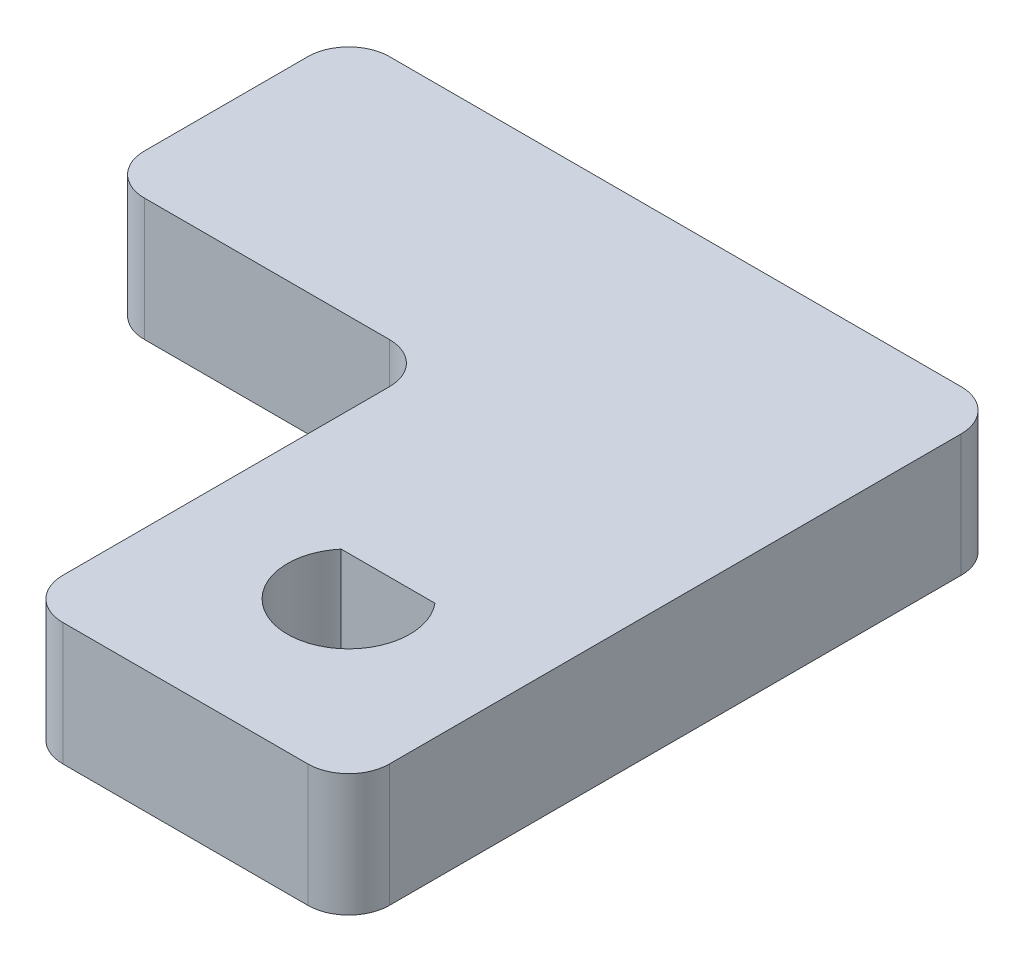
ISO-10303-21;
HEADER;
FILE_DESCRIPTION(('STEP AP214'),'2;1');
FILE_NAME('part.step','',(''),(''),'','','');
FILE_SCHEMA(('AUTOMOTIVE_DESIGN { 1 0 10303 214 1 1 1 1 }'));
ENDSEC;
DATA;
#1=APPLICATION_CONTEXT('core data for automotive mechanical design processes');
#2=APPLICATION_PROTOCOL_DEFINITION('international standard','automotive_design',2000,#1);
#3=PRODUCT_CONTEXT('',#1,'mechanical');
#4=PRODUCT('Part','Part','',(#3));
#5=PRODUCT_RELATED_PRODUCT_CATEGORY('part','',(#4));
#6=PRODUCT_DEFINITION_FORMATION('','',#4);
#7=PRODUCT_DEFINITION_CONTEXT('part definition',#1,'design');
#8=PRODUCT_DEFINITION('design','',#6,#7);
#9=PRODUCT_DEFINITION_SHAPE('','',#8);
#10=(LENGTH_UNIT() NAMED_UNIT(*) SI_UNIT(.MILLI.,.METRE.));
#11=(NAMED_UNIT(*) PLANE_ANGLE_UNIT() SI_UNIT($,.RADIAN.));
#12=(NAMED_UNIT(*) SI_UNIT($,.STERADIAN.) SOLID_ANGLE_UNIT());
#13=UNCERTAINTY_MEASURE_WITH_UNIT(LENGTH_MEASURE(1.E-05),#10,'distance_accuracy_value','');
#14=(GEOMETRIC_REPRESENTATION_CONTEXT(3) GLOBAL_UNCERTAINTY_ASSIGNED_CONTEXT((#13)) GLOBAL_UNIT_ASSIGNED_CONTEXT((#10,
#11,#12)) REPRESENTATION_CONTEXT('',''));
#15=CARTESIAN_POINT('',(0.,0.,0.));
#16=DIRECTION('',(0.,0.,1.));
#17=DIRECTION('',(1.,0.,0.));
#18=AXIS2_PLACEMENT_3D('',#15,#16,#17);
#19=CARTESIAN_POINT('',(-14.2346933710064,3.,-8.));
#20=DIRECTION('',(0.,0.,-1.));
#21=DIRECTION('',(-1.,0.,0.));
#22=AXIS2_PLACEMENT_3D('',#19,#20,#21);
#23=PLANE('',#22);
#24=DIRECTION('',(1.,0.,0.));
#25=VECTOR('',#24,1.);
#26=CARTESIAN_POINT('',(-14.2346933710064,0.,-8.));
#27=LINE('',#26,#25);
#28=CARTESIAN_POINT('',(-21.2346933710064,0.,-8.));
#29=VERTEX_POINT('',#28);
#30=CARTESIAN_POINT('',(-15.2346933710064,0.,-8.));
#31=VERTEX_POINT('',#30);
#32=EDGE_CURVE('E149',#29,#31,#27,.T.);
#33=ORIENTED_EDGE('',*,*,#32,.T.);
#34=DIRECTION('',(0.,-1.,0.));
#35=VECTOR('',#34,1.);
#36=CARTESIAN_POINT('',(-15.2346933710064,3.,-8.));
#37=LINE('',#36,#35);
#38=CARTESIAN_POINT('',(-15.2346933710064,3.,-8.));
#39=VERTEX_POINT('',#38);
#40=EDGE_CURVE('E234',#31,#39,#37,.F.);
#41=ORIENTED_EDGE('',*,*,#40,.T.);
#42=DIRECTION('',(1.,0.,0.));
#43=VECTOR('',#42,1.);
#44=CARTESIAN_POINT('',(-14.2346933710064,3.,-8.));
#45=LINE('',#44,#43);
#46=CARTESIAN_POINT('',(-21.2346933710064,3.,-8.));
#47=VERTEX_POINT('',#46);
#48=EDGE_CURVE('E151',#47,#39,#45,.T.);
#49=ORIENTED_EDGE('',*,*,#48,.F.);
#50=DIRECTION('',(0.,-1.,0.));
#51=VECTOR('',#50,1.);
#52=CARTESIAN_POINT('',(-21.2346933710064,3.,-8.));
#53=LINE('',#52,#51);
#54=EDGE_CURVE('E191',#47,#29,#53,.T.);
#55=ORIENTED_EDGE('',*,*,#54,.T.);
#56=EDGE_LOOP('',(#33,#41,#49,#55));
#57=FACE_BOUND('',#56,.T.);
#58=ADVANCED_FACE('F33',(#57),#23,.F.);
#59=CARTESIAN_POINT('',(-14.2346933710064,3.,2.));
#60=DIRECTION('',(1.,0.,0.));
#61=DIRECTION('',(0.,0.,-1.));
#62=AXIS2_PLACEMENT_3D('',#59,#60,#61);
#63=PLANE('',#62);
#64=DIRECTION('',(0.,0.,1.));
#65=VECTOR('',#64,1.);
#66=CARTESIAN_POINT('',(-14.2346933710064,3.,2.));
#67=LINE('',#66,#65);
#68=CARTESIAN_POINT('',(-14.2346933710064,3.,-7.));
#69=VERTEX_POINT('',#68);
#70=CARTESIAN_POINT('',(-14.2346933710064,3.,0.999999999999998));
#71=VERTEX_POINT('',#70);
#72=EDGE_CURVE('E154',#69,#71,#67,.T.);
#73=ORIENTED_EDGE('',*,*,#72,.F.);
#74=DIRECTION('',(0.,-1.,0.));
#75=VECTOR('',#74,1.);
#76=CARTESIAN_POINT('',(-14.2346933710064,0.,-7.));
#77=LINE('',#76,#75);
#78=CARTESIAN_POINT('',(-14.2346933710064,0.,-7.));
#79=VERTEX_POINT('',#78);
#80=EDGE_CURVE('E231',#69,#79,#77,.T.);
#81=ORIENTED_EDGE('',*,*,#80,.T.);
#82=DIRECTION('',(0.,0.,1.));
#83=VECTOR('',#82,1.);
#84=CARTESIAN_POINT('',(-14.2346933710064,0.,2.));
#85=LINE('',#84,#83);
#86=CARTESIAN_POINT('',(-14.2346933710064,0.,0.999999999999998));
#87=VERTEX_POINT('',#86);
#88=EDGE_CURVE('E170',#79,#87,#85,.T.);
#89=ORIENTED_EDGE('',*,*,#88,.T.);
#90=DIRECTION('',(0.,-1.,0.));
#91=VECTOR('',#90,1.);
#92=CARTESIAN_POINT('',(-14.2346933710064,3.,0.999999999999998));
#93=LINE('',#92,#91);
#94=EDGE_CURVE('E217',#87,#71,#93,.F.);
#95=ORIENTED_EDGE('',*,*,#94,.T.);
#96=EDGE_LOOP('',(#73,#81,#89,#95));
#97=FACE_BOUND('',#96,.T.);
#98=ADVANCED_FACE('F249',(#97),#63,.F.);
#99=CARTESIAN_POINT('',(-6.23469337100641,3.,2.));
#100=DIRECTION('',(0.,0.,-1.));
#101=DIRECTION('',(-1.,0.,0.));
#102=AXIS2_PLACEMENT_3D('',#99,#100,#101);
#103=PLANE('',#102);
#104=DIRECTION('',(1.,0.,0.));
#105=VECTOR('',#104,1.);
#106=CARTESIAN_POINT('',(-6.23469337100641,0.,2.));
#107=LINE('',#106,#105);
#108=CARTESIAN_POINT('',(-13.2346933710064,0.,2.));
#109=VERTEX_POINT('',#108);
#110=CARTESIAN_POINT('',(-7.23469337100641,0.,2.));
#111=VERTEX_POINT('',#110);
#112=EDGE_CURVE('E172',#109,#111,#107,.T.);
#113=ORIENTED_EDGE('',*,*,#112,.T.);
#114=DIRECTION('',(0.,-1.,0.));
#115=VECTOR('',#114,1.);
#116=CARTESIAN_POINT('',(-7.23469337100641,3.,2.));
#117=LINE('',#116,#115);
#118=CARTESIAN_POINT('',(-7.23469337100641,3.,2.));
#119=VERTEX_POINT('',#118);
#120=EDGE_CURVE('E227',#111,#119,#117,.F.);
#121=ORIENTED_EDGE('',*,*,#120,.T.);
#122=DIRECTION('',(1.,0.,0.));
#123=VECTOR('',#122,1.);
#124=CARTESIAN_POINT('',(-6.23469337100641,3.,2.));
#125=LINE('',#124,#123);
#126=CARTESIAN_POINT('',(-13.2346933710064,3.,2.));
#127=VERTEX_POINT('',#126);
#128=EDGE_CURVE('E157',#127,#119,#125,.T.);
#129=ORIENTED_EDGE('',*,*,#128,.F.);
#130=DIRECTION('',(0.,-1.,0.));
#131=VECTOR('',#130,1.);
#132=CARTESIAN_POINT('',(-13.2346933710064,3.,2.));
#133=LINE('',#132,#131);
#134=EDGE_CURVE('E211',#127,#109,#133,.T.);
#135=ORIENTED_EDGE('',*,*,#134,.T.);
#136=EDGE_LOOP('',(#113,#121,#129,#135));
#137=FACE_BOUND('',#136,.T.);
#138=ADVANCED_FACE('F258',(#137),#103,.F.);
#139=CARTESIAN_POINT('',(-6.23469337100641,3.,-8.));
#140=DIRECTION('',(-1.,0.,0.));
#141=DIRECTION('',(0.,0.,1.));
#142=AXIS2_PLACEMENT_3D('',#139,#140,#141);
#143=PLANE('',#142);
#144=DIRECTION('',(0.,0.,-1.));
#145=VECTOR('',#144,1.);
#146=CARTESIAN_POINT('',(-6.23469337100641,3.,2.));
#147=LINE('',#146,#145);
#148=CARTESIAN_POINT('',(-6.23469337100641,3.,0.999999999999996));
#149=VERTEX_POINT('',#148);
#150=CARTESIAN_POINT('',(-6.23469337100641,3.,-13.));
#151=VERTEX_POINT('',#150);
#152=EDGE_CURVE('E160',#149,#151,#147,.T.);
#153=ORIENTED_EDGE('',*,*,#152,.F.);
#154=DIRECTION('',(0.,-1.,0.));
#155=VECTOR('',#154,1.);
#156=CARTESIAN_POINT('',(-6.23469337100641,3.,0.999999999999996));
#157=LINE('',#156,#155);
#158=CARTESIAN_POINT('',(-6.23469337100641,0.,0.999999999999996));
#159=VERTEX_POINT('',#158);
#160=EDGE_CURVE('E222',#149,#159,#157,.T.);
#161=ORIENTED_EDGE('',*,*,#160,.T.);
#162=DIRECTION('',(0.,0.,-1.));
#163=VECTOR('',#162,1.);
#164=CARTESIAN_POINT('',(-6.23469337100641,0.,-8.));
#165=LINE('',#164,#163);
#166=CARTESIAN_POINT('',(-6.23469337100641,0.,-13.));
#167=VERTEX_POINT('',#166);
#168=EDGE_CURVE('E175',#159,#167,#165,.T.);
#169=ORIENTED_EDGE('',*,*,#168,.T.);
#170=DIRECTION('',(0.,-1.,0.));
#171=VECTOR('',#170,1.);
#172=CARTESIAN_POINT('',(-6.23469337100641,3.,-13.));
#173=LINE('',#172,#171);
#174=EDGE_CURVE('E206',#167,#151,#173,.F.);
#175=ORIENTED_EDGE('',*,*,#174,.T.);
#176=EDGE_LOOP('',(#153,#161,#169,#175));
#177=FACE_BOUND('',#176,.T.);
#178=ADVANCED_FACE('F266',(#177),#143,.F.);
#179=CARTESIAN_POINT('',(-6.23469337100641,3.,-14.));
#180=DIRECTION('',(0.,0.,1.));
#181=DIRECTION('',(1.,0.,0.));
#182=AXIS2_PLACEMENT_3D('',#179,#180,#181);
#183=PLANE('',#182);
#184=DIRECTION('',(-1.,0.,0.));
#185=VECTOR('',#184,1.);
#186=CARTESIAN_POINT('',(-6.23469337100641,3.,-14.));
#187=LINE('',#186,#185);
#188=CARTESIAN_POINT('',(-7.23469337100641,3.,-14.));
#189=VERTEX_POINT('',#188);
#190=CARTESIAN_POINT('',(-21.2346933710064,3.,-14.));
#191=VERTEX_POINT('',#190);
#192=EDGE_CURVE('E162',#189,#191,#187,.T.);
#193=ORIENTED_EDGE('',*,*,#192,.F.);
#194=DIRECTION('',(0.,-1.,0.));
#195=VECTOR('',#194,1.);
#196=CARTESIAN_POINT('',(-7.23469337100641,3.,-14.));
#197=LINE('',#196,#195);
#198=CARTESIAN_POINT('',(-7.23469337100641,0.,-14.));
#199=VERTEX_POINT('',#198);
#200=EDGE_CURVE('E200',#189,#199,#197,.T.);
#201=ORIENTED_EDGE('',*,*,#200,.T.);
#202=DIRECTION('',(-1.,0.,0.));
#203=VECTOR('',#202,1.);
#204=CARTESIAN_POINT('',(-6.23469337100641,0.,-14.));
#205=LINE('',#204,#203);
#206=CARTESIAN_POINT('',(-21.2346933710064,0.,-14.));
#207=VERTEX_POINT('',#206);
#208=EDGE_CURVE('E177',#199,#207,#205,.T.);
#209=ORIENTED_EDGE('',*,*,#208,.T.);
#210=DIRECTION('',(0.,-1.,0.));
#211=VECTOR('',#210,1.);
#212=CARTESIAN_POINT('',(-21.2346933710064,3.,-14.));
#213=LINE('',#212,#211);
#214=EDGE_CURVE('E186',#207,#191,#213,.F.);
#215=ORIENTED_EDGE('',*,*,#214,.T.);
#216=EDGE_LOOP('',(#193,#201,#209,#215));
#217=FACE_BOUND('',#216,.T.);
#218=ADVANCED_FACE('F274',(#217),#183,.F.);
#219=CARTESIAN_POINT('',(-22.2346933710064,3.,-8.));
#220=DIRECTION('',(1.,0.,0.));
#221=DIRECTION('',(0.,0.,-1.));
#222=AXIS2_PLACEMENT_3D('',#219,#220,#221);
#223=PLANE('',#222);
#224=DIRECTION('',(0.,0.,1.));
#225=VECTOR('',#224,1.);
#226=CARTESIAN_POINT('',(-22.2346933710064,0.,-8.));
#227=LINE('',#226,#225);
#228=CARTESIAN_POINT('',(-22.2346933710064,0.,-13.));
#229=VERTEX_POINT('',#228);
#230=CARTESIAN_POINT('',(-22.2346933710064,0.,-9.));
#231=VERTEX_POINT('',#230);
#232=EDGE_CURVE('E155',#229,#231,#227,.T.);
#233=ORIENTED_EDGE('',*,*,#232,.T.);
#234=DIRECTION('',(0.,-1.,0.));
#235=VECTOR('',#234,1.);
#236=CARTESIAN_POINT('',(-22.2346933710064,3.,-9.));
#237=LINE('',#236,#235);
#238=CARTESIAN_POINT('',(-22.2346933710064,3.,-9.));
#239=VERTEX_POINT('',#238);
#240=EDGE_CURVE('E196',#231,#239,#237,.F.);
#241=ORIENTED_EDGE('',*,*,#240,.T.);
#242=DIRECTION('',(0.,0.,1.));
#243=VECTOR('',#242,1.);
#244=CARTESIAN_POINT('',(-22.2346933710064,3.,-8.));
#245=LINE('',#244,#243);
#246=CARTESIAN_POINT('',(-22.2346933710064,3.,-13.));
#247=VERTEX_POINT('',#246);
#248=EDGE_CURVE('E164',#247,#239,#245,.T.);
#249=ORIENTED_EDGE('',*,*,#248,.F.);
#250=DIRECTION('',(0.,-1.,0.));
#251=VECTOR('',#250,1.);
#252=CARTESIAN_POINT('',(-22.2346933710064,3.,-13.));
#253=LINE('',#252,#251);
#254=EDGE_CURVE('E167',#247,#229,#253,.T.);
#255=ORIENTED_EDGE('',*,*,#254,.T.);
#256=EDGE_LOOP('',(#233,#241,#249,#255));
#257=FACE_BOUND('',#256,.T.);
#258=ADVANCED_FACE('F284',(#257),#223,.F.);
#259=CARTESIAN_POINT('',(0.,3.,0.));
#260=DIRECTION('',(0.,-1.,0.));
#261=DIRECTION('',(0.,0.,-1.));
#262=AXIS2_PLACEMENT_3D('',#259,#260,#261);
#263=PLANE('',#262);
#264=DIRECTION('',(-1.,0.,0.));
#265=VECTOR('',#264,1.);
#266=CARTESIAN_POINT('',(-11.3832215052238,3.,-2.96482284638747));
#267=LINE('',#266,#265);
#268=CARTESIAN_POINT('',(-9.08616523678906,3.,-2.96482284638747));
#269=VERTEX_POINT('',#268);
#270=CARTESIAN_POINT('',(-11.3832215052238,3.,-2.96482284638747));
#271=VERTEX_POINT('',#270);
#272=EDGE_CURVE('E144',#269,#271,#267,.T.);
#273=ORIENTED_EDGE('',*,*,#272,.F.);
#274=CARTESIAN_POINT('',(-10.2346933710064,3.,-2.));
#275=DIRECTION('',(0.,1.,0.));
#276=DIRECTION('',(0.,0.,1.));
#277=AXIS2_PLACEMENT_3D('',#274,#275,#276);
#278=CIRCLE('',#277,1.5);
#279=EDGE_CURVE('E48',#271,#269,#278,.T.);
#280=ORIENTED_EDGE('',*,*,#279,.F.);
#281=EDGE_LOOP('',(#273,#280));
#282=FACE_BOUND('',#281,.T.);
#283=ORIENTED_EDGE('',*,*,#128,.T.);
#284=CARTESIAN_POINT('',(-7.23469337100641,3.,0.999999999999996));
#285=DIRECTION('',(0.,-1.,0.));
#286=DIRECTION('',(0.,0.,-1.));
#287=AXIS2_PLACEMENT_3D('',#284,#285,#286);
#288=CIRCLE('',#287,1.);
#289=EDGE_CURVE('E229',#119,#149,#288,.F.);
#290=ORIENTED_EDGE('',*,*,#289,.T.);
#291=ORIENTED_EDGE('',*,*,#152,.T.);
#292=CARTESIAN_POINT('',(-7.23469337100641,3.,-13.));
#293=DIRECTION('',(0.,-1.,0.));
#294=DIRECTION('',(0.,0.,-1.));
#295=AXIS2_PLACEMENT_3D('',#292,#293,#294);
#296=CIRCLE('',#295,1.);
#297=EDGE_CURVE('E209',#151,#189,#296,.F.);
#298=ORIENTED_EDGE('',*,*,#297,.T.);
#299=ORIENTED_EDGE('',*,*,#192,.T.);
#300=CARTESIAN_POINT('',(-21.2346933710064,3.,-13.));
#301=DIRECTION('',(0.,-1.,0.));
#302=DIRECTION('',(0.,0.,-1.));
#303=AXIS2_PLACEMENT_3D('',#300,#301,#302);
#304=CIRCLE('',#303,1.);
#305=EDGE_CURVE('E189',#191,#247,#304,.F.);
#306=ORIENTED_EDGE('',*,*,#305,.T.);
#307=ORIENTED_EDGE('',*,*,#248,.T.);
#308=CARTESIAN_POINT('',(-21.2346933710064,3.,-9.));
#309=DIRECTION('',(0.,-1.,0.));
#310=DIRECTION('',(0.,0.,-1.));
#311=AXIS2_PLACEMENT_3D('',#308,#309,#310);
#312=CIRCLE('',#311,1.);
#313=EDGE_CURVE('E198',#239,#47,#312,.F.);
#314=ORIENTED_EDGE('',*,*,#313,.T.);
#315=ORIENTED_EDGE('',*,*,#48,.T.);
#316=CARTESIAN_POINT('',(-15.2346933710064,3.,-7.));
#317=DIRECTION('',(0.,-1.,0.));
#318=DIRECTION('',(0.,0.,-1.));
#319=AXIS2_PLACEMENT_3D('',#316,#317,#318);
#320=CIRCLE('',#319,1.);
#321=EDGE_CURVE('E11',#39,#69,#320,.T.);
#322=ORIENTED_EDGE('',*,*,#321,.T.);
#323=ORIENTED_EDGE('',*,*,#72,.T.);
#324=CARTESIAN_POINT('',(-13.2346933710064,3.,0.999999999999998));
#325=DIRECTION('',(0.,-1.,0.));
#326=DIRECTION('',(0.,0.,-1.));
#327=AXIS2_PLACEMENT_3D('',#324,#325,#326);
#328=CIRCLE('',#327,1.);
#329=EDGE_CURVE('E220',#71,#127,#328,.F.);
#330=ORIENTED_EDGE('',*,*,#329,.T.);
#331=EDGE_LOOP('',(#283,#290,#291,#298,#299,#306,#307,#314,#315,#322,#323,#330));
#332=FACE_BOUND('',#331,.T.);
#333=ADVANCED_FACE('F247',(#282,#332),#263,.F.);
#334=CARTESIAN_POINT('',(0.,0.,0.));
#335=DIRECTION('',(0.,-1.,0.));
#336=DIRECTION('',(0.,0.,-1.));
#337=AXIS2_PLACEMENT_3D('',#334,#335,#336);
#338=PLANE('',#337);
#339=CARTESIAN_POINT('',(-10.2346933710064,0.,-2.));
#340=DIRECTION('',(0.,1.,0.));
#341=DIRECTION('',(0.,0.,1.));
#342=AXIS2_PLACEMENT_3D('',#339,#340,#341);
#343=CIRCLE('',#342,1.5);
#344=CARTESIAN_POINT('',(-11.3832215052238,0.,-2.96482284638747));
#345=VERTEX_POINT('',#344);
#346=CARTESIAN_POINT('',(-9.08616523678906,0.,-2.96482284638747));
#347=VERTEX_POINT('',#346);
#348=EDGE_CURVE('E53',#345,#347,#343,.T.);
#349=ORIENTED_EDGE('',*,*,#348,.T.);
#350=DIRECTION('',(-1.,0.,0.));
#351=VECTOR('',#350,1.);
#352=CARTESIAN_POINT('',(-11.3832215052238,0.,-2.96482284638747));
#353=LINE('',#352,#351);
#354=EDGE_CURVE('E136',#347,#345,#353,.T.);
#355=ORIENTED_EDGE('',*,*,#354,.T.);
#356=EDGE_LOOP('',(#349,#355));
#357=FACE_BOUND('',#356,.T.);
#358=ORIENTED_EDGE('',*,*,#168,.F.);
#359=CARTESIAN_POINT('',(-7.23469337100641,0.,0.999999999999996));
#360=DIRECTION('',(0.,-1.,0.));
#361=DIRECTION('',(0.,0.,-1.));
#362=AXIS2_PLACEMENT_3D('',#359,#360,#361);
#363=CIRCLE('',#362,1.);
#364=EDGE_CURVE('E225',#159,#111,#363,.T.);
#365=ORIENTED_EDGE('',*,*,#364,.T.);
#366=ORIENTED_EDGE('',*,*,#112,.F.);
#367=CARTESIAN_POINT('',(-13.2346933710064,0.,0.999999999999998));
#368=DIRECTION('',(0.,-1.,0.));
#369=DIRECTION('',(0.,0.,-1.));
#370=AXIS2_PLACEMENT_3D('',#367,#368,#369);
#371=CIRCLE('',#370,1.);
#372=EDGE_CURVE('E214',#109,#87,#371,.T.);
#373=ORIENTED_EDGE('',*,*,#372,.T.);
#374=ORIENTED_EDGE('',*,*,#88,.F.);
#375=CARTESIAN_POINT('',(-15.2346933710064,0.,-7.));
#376=DIRECTION('',(0.,-1.,0.));
#377=DIRECTION('',(0.,0.,-1.));
#378=AXIS2_PLACEMENT_3D('',#375,#376,#377);
#379=CIRCLE('',#378,1.);
#380=EDGE_CURVE('E41',#79,#31,#379,.F.);
#381=ORIENTED_EDGE('',*,*,#380,.T.);
#382=ORIENTED_EDGE('',*,*,#32,.F.);
#383=CARTESIAN_POINT('',(-21.2346933710064,0.,-9.));
#384=DIRECTION('',(0.,-1.,0.));
#385=DIRECTION('',(0.,0.,-1.));
#386=AXIS2_PLACEMENT_3D('',#383,#384,#385);
#387=CIRCLE('',#386,1.);
#388=EDGE_CURVE('E194',#29,#231,#387,.T.);
#389=ORIENTED_EDGE('',*,*,#388,.T.);
#390=ORIENTED_EDGE('',*,*,#232,.F.);
#391=CARTESIAN_POINT('',(-21.2346933710064,0.,-13.));
#392=DIRECTION('',(0.,-1.,0.));
#393=DIRECTION('',(0.,0.,-1.));
#394=AXIS2_PLACEMENT_3D('',#391,#392,#393);
#395=CIRCLE('',#394,1.);
#396=EDGE_CURVE('E183',#229,#207,#395,.T.);
#397=ORIENTED_EDGE('',*,*,#396,.T.);
#398=ORIENTED_EDGE('',*,*,#208,.F.);
#399=CARTESIAN_POINT('',(-7.23469337100641,0.,-13.));
#400=DIRECTION('',(0.,-1.,0.));
#401=DIRECTION('',(0.,0.,-1.));
#402=AXIS2_PLACEMENT_3D('',#399,#400,#401);
#403=CIRCLE('',#402,1.);
#404=EDGE_CURVE('E203',#199,#167,#403,.T.);
#405=ORIENTED_EDGE('',*,*,#404,.T.);
#406=EDGE_LOOP('',(#358,#365,#366,#373,#374,#381,#382,#389,#390,#397,#398,#405));
#407=FACE_BOUND('',#406,.T.);
#408=ADVANCED_FACE('F142',(#357,#407),#338,.T.);
#409=CARTESIAN_POINT('',(-21.2346933710064,3.,-13.));
#410=DIRECTION('',(0.,-1.,0.));
#411=DIRECTION('',(0.,0.,-1.));
#412=AXIS2_PLACEMENT_3D('',#409,#410,#411);
#413=CYLINDRICAL_SURFACE('',#412,1.);
#414=ORIENTED_EDGE('',*,*,#305,.F.);
#415=ORIENTED_EDGE('',*,*,#214,.F.);
#416=ORIENTED_EDGE('',*,*,#396,.F.);
#417=ORIENTED_EDGE('',*,*,#254,.F.);
#418=EDGE_LOOP('',(#414,#415,#416,#417));
#419=FACE_BOUND('',#418,.T.);
#420=ADVANCED_FACE('F280',(#419),#413,.T.);
#421=CARTESIAN_POINT('',(-21.2346933710064,3.,-9.));
#422=DIRECTION('',(0.,-1.,0.));
#423=DIRECTION('',(0.,0.,-1.));
#424=AXIS2_PLACEMENT_3D('',#421,#422,#423);
#425=CYLINDRICAL_SURFACE('',#424,1.);
#426=ORIENTED_EDGE('',*,*,#313,.F.);
#427=ORIENTED_EDGE('',*,*,#240,.F.);
#428=ORIENTED_EDGE('',*,*,#388,.F.);
#429=ORIENTED_EDGE('',*,*,#54,.F.);
#430=EDGE_LOOP('',(#426,#427,#428,#429));
#431=FACE_BOUND('',#430,.T.);
#432=ADVANCED_FACE('F288',(#431),#425,.T.);
#433=CARTESIAN_POINT('',(-7.23469337100641,3.,-13.));
#434=DIRECTION('',(0.,-1.,0.));
#435=DIRECTION('',(0.,0.,-1.));
#436=AXIS2_PLACEMENT_3D('',#433,#434,#435);
#437=CYLINDRICAL_SURFACE('',#436,1.);
#438=ORIENTED_EDGE('',*,*,#297,.F.);
#439=ORIENTED_EDGE('',*,*,#174,.F.);
#440=ORIENTED_EDGE('',*,*,#404,.F.);
#441=ORIENTED_EDGE('',*,*,#200,.F.);
#442=EDGE_LOOP('',(#438,#439,#440,#441));
#443=FACE_BOUND('',#442,.T.);
#444=ADVANCED_FACE('F271',(#443),#437,.T.);
#445=CARTESIAN_POINT('',(-13.2346933710064,3.,0.999999999999998));
#446=DIRECTION('',(0.,-1.,0.));
#447=DIRECTION('',(0.,0.,-1.));
#448=AXIS2_PLACEMENT_3D('',#445,#446,#447);
#449=CYLINDRICAL_SURFACE('',#448,1.);
#450=ORIENTED_EDGE('',*,*,#329,.F.);
#451=ORIENTED_EDGE('',*,*,#94,.F.);
#452=ORIENTED_EDGE('',*,*,#372,.F.);
#453=ORIENTED_EDGE('',*,*,#134,.F.);
#454=EDGE_LOOP('',(#450,#451,#452,#453));
#455=FACE_BOUND('',#454,.T.);
#456=ADVANCED_FACE('F254',(#455),#449,.T.);
#457=CARTESIAN_POINT('',(-7.23469337100641,3.,0.999999999999996));
#458=DIRECTION('',(0.,-1.,0.));
#459=DIRECTION('',(0.,0.,-1.));
#460=AXIS2_PLACEMENT_3D('',#457,#458,#459);
#461=CYLINDRICAL_SURFACE('',#460,1.);
#462=ORIENTED_EDGE('',*,*,#289,.F.);
#463=ORIENTED_EDGE('',*,*,#120,.F.);
#464=ORIENTED_EDGE('',*,*,#364,.F.);
#465=ORIENTED_EDGE('',*,*,#160,.F.);
#466=EDGE_LOOP('',(#462,#463,#464,#465));
#467=FACE_BOUND('',#466,.T.);
#468=ADVANCED_FACE('F262',(#467),#461,.T.);
#469=CARTESIAN_POINT('',(-15.2346933710064,3.,-7.));
#470=DIRECTION('',(0.,1.,0.));
#471=DIRECTION('',(0.,0.,1.));
#472=AXIS2_PLACEMENT_3D('',#469,#470,#471);
#473=CYLINDRICAL_SURFACE('',#472,1.);
#474=ORIENTED_EDGE('',*,*,#321,.F.);
#475=ORIENTED_EDGE('',*,*,#40,.F.);
#476=ORIENTED_EDGE('',*,*,#380,.F.);
#477=ORIENTED_EDGE('',*,*,#80,.F.);
#478=EDGE_LOOP('',(#474,#475,#476,#477));
#479=FACE_BOUND('',#478,.T.);
#480=ADVANCED_FACE('F35',(#479),#473,.F.);
#481=CARTESIAN_POINT('',(-10.2346933710064,0.,-2.));
#482=DIRECTION('',(0.,1.,0.));
#483=DIRECTION('',(0.,0.,1.));
#484=AXIS2_PLACEMENT_3D('',#481,#482,#483);
#485=CYLINDRICAL_SURFACE('',#484,1.5);
#486=ORIENTED_EDGE('',*,*,#279,.T.);
#487=DIRECTION('',(0.,1.,0.));
#488=VECTOR('',#487,1.);
#489=CARTESIAN_POINT('',(-9.08616523678906,0.,-2.96482284638747));
#490=LINE('',#489,#488);
#491=EDGE_CURVE('E129',#347,#269,#490,.T.);
#492=ORIENTED_EDGE('',*,*,#491,.F.);
#493=ORIENTED_EDGE('',*,*,#348,.F.);
#494=DIRECTION('',(0.,1.,0.));
#495=VECTOR('',#494,1.);
#496=CARTESIAN_POINT('',(-11.3832215052238,0.,-2.96482284638747));
#497=LINE('',#496,#495);
#498=EDGE_CURVE('E135',#345,#271,#497,.T.);
#499=ORIENTED_EDGE('',*,*,#498,.T.);
#500=EDGE_LOOP('',(#486,#492,#493,#499));
#501=FACE_BOUND('',#500,.T.);
#502=ADVANCED_FACE('F131',(#501),#485,.F.);
#503=CARTESIAN_POINT('',(-11.3832215052238,0.,-2.96482284638747));
#504=DIRECTION('',(0.,0.,-1.));
#505=DIRECTION('',(-1.,0.,0.));
#506=AXIS2_PLACEMENT_3D('',#503,#504,#505);
#507=PLANE('',#506);
#508=ORIENTED_EDGE('',*,*,#272,.T.);
#509=ORIENTED_EDGE('',*,*,#498,.F.);
#510=ORIENTED_EDGE('',*,*,#354,.F.);
#511=ORIENTED_EDGE('',*,*,#491,.T.);
#512=EDGE_LOOP('',(#508,#509,#510,#511));
#513=FACE_BOUND('',#512,.T.);
#514=ADVANCED_FACE('F139',(#513),#507,.F.);
#515=CLOSED_SHELL('',(#58,#98,#138,#178,#218,#258,#333,#408,#420,#432,#444,#456,#468,#480,#502,#514));
#516=MANIFOLD_SOLID_BREP('B2',#515);
#517=ADVANCED_BREP_SHAPE_REPRESENTATION('',(#18,#516),#14);
#518=SHAPE_DEFINITION_REPRESENTATION(#9,#517);
ENDSEC;
END-ISO-10303-21;
